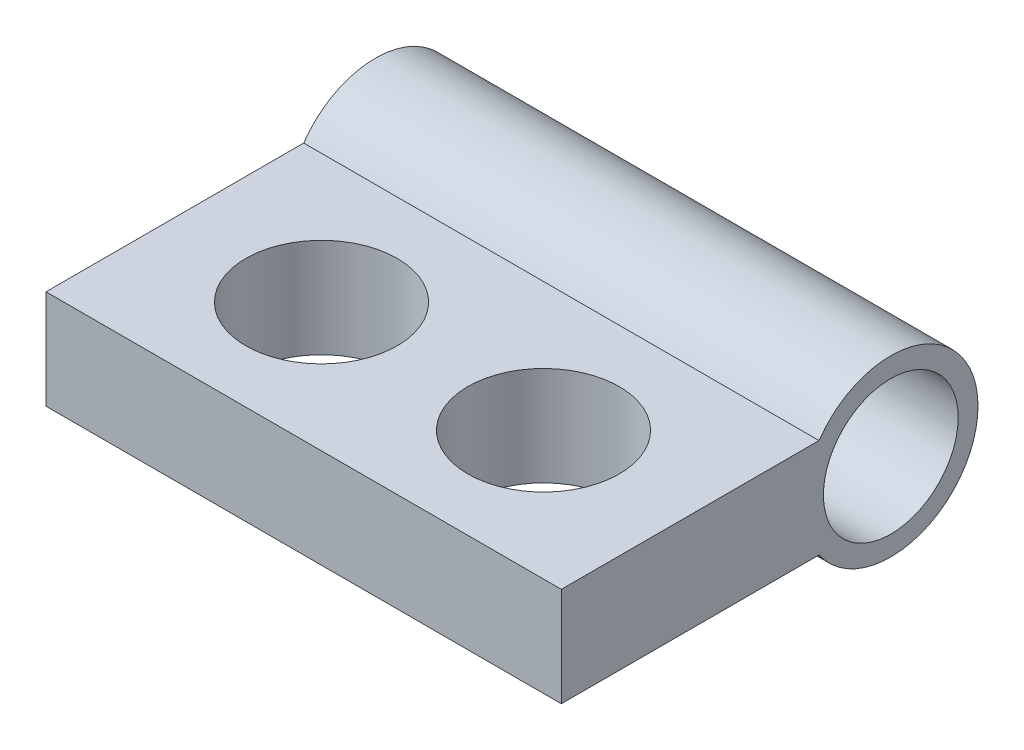
ISO-10303-21;
HEADER;
FILE_DESCRIPTION(('STEP AP214'),'2;1');
FILE_NAME('part.step','',(''),(''),'','','');
FILE_SCHEMA(('AUTOMOTIVE_DESIGN { 1 0 10303 214 1 1 1 1 }'));
ENDSEC;
DATA;
#1=APPLICATION_CONTEXT('core data for automotive mechanical design processes');
#2=APPLICATION_PROTOCOL_DEFINITION('international standard','automotive_design',2000,#1);
#3=PRODUCT_CONTEXT('',#1,'mechanical');
#4=PRODUCT('Part','Part','',(#3));
#5=PRODUCT_RELATED_PRODUCT_CATEGORY('part','',(#4));
#6=PRODUCT_DEFINITION_FORMATION('','',#4);
#7=PRODUCT_DEFINITION_CONTEXT('part definition',#1,'design');
#8=PRODUCT_DEFINITION('design','',#6,#7);
#9=PRODUCT_DEFINITION_SHAPE('','',#8);
#10=(LENGTH_UNIT() NAMED_UNIT(*) SI_UNIT(.MILLI.,.METRE.));
#11=(NAMED_UNIT(*) PLANE_ANGLE_UNIT() SI_UNIT($,.RADIAN.));
#12=(NAMED_UNIT(*) SI_UNIT($,.STERADIAN.) SOLID_ANGLE_UNIT());
#13=UNCERTAINTY_MEASURE_WITH_UNIT(LENGTH_MEASURE(1.E-05),#10,'distance_accuracy_value','');
#14=(GEOMETRIC_REPRESENTATION_CONTEXT(3) GLOBAL_UNCERTAINTY_ASSIGNED_CONTEXT((#13)) GLOBAL_UNIT_ASSIGNED_CONTEXT((#10,
#11,#12)) REPRESENTATION_CONTEXT('',''));
#15=CARTESIAN_POINT('',(0.,0.,0.));
#16=DIRECTION('',(0.,0.,1.));
#17=DIRECTION('',(1.,0.,0.));
#18=AXIS2_PLACEMENT_3D('',#15,#16,#17);
#19=CARTESIAN_POINT('',(0.,15.875,0.));
#20=DIRECTION('',(0.,-1.,0.));
#21=DIRECTION('',(0.,0.,-1.));
#22=AXIS2_PLACEMENT_3D('',#19,#20,#21);
#23=PLANE('',#22);
#24=DIRECTION('',(0.,0.,-1.));
#25=VECTOR('',#24,1.);
#26=CARTESIAN_POINT('',(41.275,15.875,20.6375));
#27=LINE('',#26,#25);
#28=CARTESIAN_POINT('',(41.275,15.875,20.6375));
#29=VERTEX_POINT('',#28);
#30=CARTESIAN_POINT('',(41.275,15.875,-20.6375));
#31=VERTEX_POINT('',#30);
#32=EDGE_CURVE('E73',#29,#31,#27,.T.);
#33=ORIENTED_EDGE('',*,*,#32,.T.);
#34=DIRECTION('',(-1.,0.,0.));
#35=VECTOR('',#34,1.);
#36=CARTESIAN_POINT('',(-41.275,15.875,-20.6375));
#37=LINE('',#36,#35);
#38=CARTESIAN_POINT('',(-41.275,15.875,-20.6375));
#39=VERTEX_POINT('',#38);
#40=EDGE_CURVE('E96',#31,#39,#37,.T.);
#41=ORIENTED_EDGE('',*,*,#40,.T.);
#42=DIRECTION('',(0.,0.,1.));
#43=VECTOR('',#42,1.);
#44=CARTESIAN_POINT('',(-41.275,15.875,20.6375));
#45=LINE('',#44,#43);
#46=CARTESIAN_POINT('',(-41.275,15.875,20.6375));
#47=VERTEX_POINT('',#46);
#48=EDGE_CURVE('E94',#39,#47,#45,.T.);
#49=ORIENTED_EDGE('',*,*,#48,.T.);
#50=DIRECTION('',(1.,0.,0.));
#51=VECTOR('',#50,1.);
#52=CARTESIAN_POINT('',(-41.275,15.875,20.6375));
#53=LINE('',#52,#51);
#54=EDGE_CURVE('E50',#47,#29,#53,.T.);
#55=ORIENTED_EDGE('',*,*,#54,.T.);
#56=EDGE_LOOP('',(#33,#41,#49,#55));
#57=FACE_BOUND('',#56,.T.);
#58=CARTESIAN_POINT('',(17.78,15.875,0.));
#59=DIRECTION('',(0.,1.,0.));
#60=DIRECTION('',(0.,0.,1.));
#61=AXIS2_PLACEMENT_3D('',#58,#59,#60);
#62=CIRCLE('',#61,12.1285);
#63=CARTESIAN_POINT('',(17.78,15.875,12.1285));
#64=VERTEX_POINT('',#63);
#65=EDGE_CURVE('E85',#64,#64,#62,.T.);
#66=ORIENTED_EDGE('',*,*,#65,.F.);
#67=EDGE_LOOP('',(#66));
#68=FACE_BOUND('',#67,.T.);
#69=CARTESIAN_POINT('',(-17.78,15.875,0.));
#70=DIRECTION('',(0.,1.,0.));
#71=DIRECTION('',(0.,0.,-1.));
#72=AXIS2_PLACEMENT_3D('',#69,#70,#71);
#73=CIRCLE('',#72,12.1285);
#74=CARTESIAN_POINT('',(-17.78,15.875,-12.1285));
#75=VERTEX_POINT('',#74);
#76=EDGE_CURVE('E101',#75,#75,#73,.T.);
#77=ORIENTED_EDGE('',*,*,#76,.F.);
#78=EDGE_LOOP('',(#77));
#79=FACE_BOUND('',#78,.T.);
#80=ADVANCED_FACE('F33',(#57,#68,#79),#23,.F.);
#81=CARTESIAN_POINT('',(0.,0.,0.));
#82=DIRECTION('',(0.,-1.,0.));
#83=DIRECTION('',(0.,0.,-1.));
#84=AXIS2_PLACEMENT_3D('',#81,#82,#83);
#85=PLANE('',#84);
#86=CARTESIAN_POINT('',(17.78,0.,0.));
#87=DIRECTION('',(0.,1.,0.));
#88=DIRECTION('',(0.,0.,1.));
#89=AXIS2_PLACEMENT_3D('',#86,#87,#88);
#90=CIRCLE('',#89,12.1285);
#91=CARTESIAN_POINT('',(17.78,0.,12.1285));
#92=VERTEX_POINT('',#91);
#93=EDGE_CURVE('E89',#92,#92,#90,.T.);
#94=ORIENTED_EDGE('',*,*,#93,.T.);
#95=EDGE_LOOP('',(#94));
#96=FACE_BOUND('',#95,.T.);
#97=DIRECTION('',(0.,0.,-1.));
#98=VECTOR('',#97,1.);
#99=CARTESIAN_POINT('',(41.275,0.,20.6375));
#100=LINE('',#99,#98);
#101=CARTESIAN_POINT('',(41.275,0.,20.6375));
#102=VERTEX_POINT('',#101);
#103=CARTESIAN_POINT('',(41.275,0.,-20.6375));
#104=VERTEX_POINT('',#103);
#105=EDGE_CURVE('E79',#102,#104,#100,.T.);
#106=ORIENTED_EDGE('',*,*,#105,.F.);
#107=DIRECTION('',(1.,0.,0.));
#108=VECTOR('',#107,1.);
#109=CARTESIAN_POINT('',(-41.275,0.,20.6375));
#110=LINE('',#109,#108);
#111=CARTESIAN_POINT('',(-41.275,0.,20.6375));
#112=VERTEX_POINT('',#111);
#113=EDGE_CURVE('E67',#112,#102,#110,.T.);
#114=ORIENTED_EDGE('',*,*,#113,.F.);
#115=DIRECTION('',(0.,0.,1.));
#116=VECTOR('',#115,1.);
#117=CARTESIAN_POINT('',(-41.275,0.,20.6375));
#118=LINE('',#117,#116);
#119=CARTESIAN_POINT('',(-41.275,0.,-20.6375));
#120=VERTEX_POINT('',#119);
#121=EDGE_CURVE('E63',#120,#112,#118,.T.);
#122=ORIENTED_EDGE('',*,*,#121,.F.);
#123=DIRECTION('',(-1.,0.,0.));
#124=VECTOR('',#123,1.);
#125=CARTESIAN_POINT('',(-41.275,0.,-20.6375));
#126=LINE('',#125,#124);
#127=EDGE_CURVE('E84',#104,#120,#126,.T.);
#128=ORIENTED_EDGE('',*,*,#127,.F.);
#129=EDGE_LOOP('',(#106,#114,#122,#128));
#130=FACE_BOUND('',#129,.T.);
#131=CARTESIAN_POINT('',(-17.78,0.,0.));
#132=DIRECTION('',(0.,1.,0.));
#133=DIRECTION('',(0.,0.,-1.));
#134=AXIS2_PLACEMENT_3D('',#131,#132,#133);
#135=CIRCLE('',#134,12.1285);
#136=CARTESIAN_POINT('',(-17.78,0.,-12.1285));
#137=VERTEX_POINT('',#136);
#138=EDGE_CURVE('E103',#137,#137,#135,.T.);
#139=ORIENTED_EDGE('',*,*,#138,.T.);
#140=EDGE_LOOP('',(#139));
#141=FACE_BOUND('',#140,.T.);
#142=ADVANCED_FACE('F81',(#96,#130,#141),#85,.T.);
#143=CARTESIAN_POINT('',(41.275,15.875,20.6375));
#144=DIRECTION('',(-1.,0.,0.));
#145=DIRECTION('',(0.,0.,1.));
#146=AXIS2_PLACEMENT_3D('',#143,#144,#145);
#147=PLANE('',#146);
#148=ORIENTED_EDGE('',*,*,#105,.T.);
#149=CARTESIAN_POINT('',(41.275,7.9375,-32.1334555387971));
#150=DIRECTION('',(1.,0.,0.));
#151=DIRECTION('',(0.,0.,-1.));
#152=AXIS2_PLACEMENT_3D('',#149,#150,#151);
#153=CIRCLE('',#152,13.97);
#154=EDGE_CURVE('E112',#104,#31,#153,.T.);
#155=ORIENTED_EDGE('',*,*,#154,.T.);
#156=ORIENTED_EDGE('',*,*,#32,.F.);
#157=DIRECTION('',(0.,-1.,0.));
#158=VECTOR('',#157,1.);
#159=CARTESIAN_POINT('',(41.275,15.875,20.6375));
#160=LINE('',#159,#158);
#161=EDGE_CURVE('E42',#29,#102,#160,.T.);
#162=ORIENTED_EDGE('',*,*,#161,.T.);
#163=EDGE_LOOP('',(#148,#155,#156,#162));
#164=FACE_BOUND('',#163,.T.);
#165=CARTESIAN_POINT('',(41.275,7.9375,-32.1334555387971));
#166=DIRECTION('',(1.,0.,0.));
#167=DIRECTION('',(0.,0.,-1.));
#168=AXIS2_PLACEMENT_3D('',#165,#166,#167);
#169=CIRCLE('',#168,10.795);
#170=CARTESIAN_POINT('',(41.275,7.9375,-42.9284555387971));
#171=VERTEX_POINT('',#170);
#172=EDGE_CURVE('E114',#171,#171,#169,.T.);
#173=ORIENTED_EDGE('',*,*,#172,.F.);
#174=EDGE_LOOP('',(#173));
#175=FACE_BOUND('',#174,.T.);
#176=ADVANCED_FACE('F35',(#164,#175),#147,.F.);
#177=CARTESIAN_POINT('',(-41.275,15.875,20.6375));
#178=DIRECTION('',(1.,0.,0.));
#179=DIRECTION('',(0.,0.,-1.));
#180=AXIS2_PLACEMENT_3D('',#177,#178,#179);
#181=PLANE('',#180);
#182=ORIENTED_EDGE('',*,*,#48,.F.);
#183=CARTESIAN_POINT('',(-41.275,7.9375,-32.1334555387971));
#184=DIRECTION('',(1.,0.,0.));
#185=DIRECTION('',(0.,0.,-1.));
#186=AXIS2_PLACEMENT_3D('',#183,#184,#185);
#187=CIRCLE('',#186,13.97);
#188=EDGE_CURVE('E106',#39,#120,#187,.F.);
#189=ORIENTED_EDGE('',*,*,#188,.T.);
#190=ORIENTED_EDGE('',*,*,#121,.T.);
#191=DIRECTION('',(0.,-1.,0.));
#192=VECTOR('',#191,1.);
#193=CARTESIAN_POINT('',(-41.275,15.875,20.6375));
#194=LINE('',#193,#192);
#195=EDGE_CURVE('E11',#47,#112,#194,.T.);
#196=ORIENTED_EDGE('',*,*,#195,.F.);
#197=EDGE_LOOP('',(#182,#189,#190,#196));
#198=FACE_BOUND('',#197,.T.);
#199=CARTESIAN_POINT('',(-41.275,7.9375,-32.1334555387971));
#200=DIRECTION('',(1.,0.,0.));
#201=DIRECTION('',(0.,0.,-1.));
#202=AXIS2_PLACEMENT_3D('',#199,#200,#201);
#203=CIRCLE('',#202,10.795);
#204=CARTESIAN_POINT('',(-41.275,7.9375,-42.9284555387971));
#205=VERTEX_POINT('',#204);
#206=EDGE_CURVE('E109',#205,#205,#203,.F.);
#207=ORIENTED_EDGE('',*,*,#206,.F.);
#208=EDGE_LOOP('',(#207));
#209=FACE_BOUND('',#208,.T.);
#210=ADVANCED_FACE('F119',(#198,#209),#181,.F.);
#211=CARTESIAN_POINT('',(-41.275,15.875,20.6375));
#212=DIRECTION('',(0.,0.,-1.));
#213=DIRECTION('',(-1.,0.,0.));
#214=AXIS2_PLACEMENT_3D('',#211,#212,#213);
#215=PLANE('',#214);
#216=ORIENTED_EDGE('',*,*,#113,.T.);
#217=ORIENTED_EDGE('',*,*,#161,.F.);
#218=ORIENTED_EDGE('',*,*,#54,.F.);
#219=ORIENTED_EDGE('',*,*,#195,.T.);
#220=EDGE_LOOP('',(#216,#217,#218,#219));
#221=FACE_BOUND('',#220,.T.);
#222=ADVANCED_FACE('F69',(#221),#215,.F.);
#223=CARTESIAN_POINT('',(17.78,15.875,0.));
#224=DIRECTION('',(0.,-1.,0.));
#225=DIRECTION('',(0.,0.,-1.));
#226=AXIS2_PLACEMENT_3D('',#223,#224,#225);
#227=CYLINDRICAL_SURFACE('',#226,12.1285);
#228=ORIENTED_EDGE('',*,*,#65,.T.);
#229=EDGE_LOOP('',(#228));
#230=FACE_BOUND('',#229,.T.);
#231=ORIENTED_EDGE('',*,*,#93,.F.);
#232=EDGE_LOOP('',(#231));
#233=FACE_BOUND('',#232,.T.);
#234=ADVANCED_FACE('F139',(#230,#233),#227,.F.);
#235=CARTESIAN_POINT('',(-17.78,15.875,0.));
#236=DIRECTION('',(0.,-1.,0.));
#237=DIRECTION('',(0.,0.,-1.));
#238=AXIS2_PLACEMENT_3D('',#235,#236,#237);
#239=CYLINDRICAL_SURFACE('',#238,12.1285);
#240=ORIENTED_EDGE('',*,*,#76,.T.);
#241=EDGE_LOOP('',(#240));
#242=FACE_BOUND('',#241,.T.);
#243=ORIENTED_EDGE('',*,*,#138,.F.);
#244=EDGE_LOOP('',(#243));
#245=FACE_BOUND('',#244,.T.);
#246=ADVANCED_FACE('F136',(#242,#245),#239,.F.);
#247=CARTESIAN_POINT('',(-80.7881269327043,7.9375,-32.1334555387971));
#248=DIRECTION('',(1.,0.,0.));
#249=DIRECTION('',(0.,0.,-1.));
#250=AXIS2_PLACEMENT_3D('',#247,#248,#249);
#251=CYLINDRICAL_SURFACE('',#250,13.97);
#252=ORIENTED_EDGE('',*,*,#127,.T.);
#253=ORIENTED_EDGE('',*,*,#188,.F.);
#254=ORIENTED_EDGE('',*,*,#40,.F.);
#255=ORIENTED_EDGE('',*,*,#154,.F.);
#256=EDGE_LOOP('',(#252,#253,#254,#255));
#257=FACE_BOUND('',#256,.T.);
#258=ADVANCED_FACE('F125',(#257),#251,.T.);
#259=CARTESIAN_POINT('',(-80.7881269327043,7.9375,-32.1334555387971));
#260=DIRECTION('',(1.,0.,0.));
#261=DIRECTION('',(0.,0.,-1.));
#262=AXIS2_PLACEMENT_3D('',#259,#260,#261);
#263=CYLINDRICAL_SURFACE('',#262,10.795);
#264=ORIENTED_EDGE('',*,*,#206,.T.);
#265=EDGE_LOOP('',(#264));
#266=FACE_BOUND('',#265,.T.);
#267=ORIENTED_EDGE('',*,*,#172,.T.);
#268=EDGE_LOOP('',(#267));
#269=FACE_BOUND('',#268,.T.);
#270=ADVANCED_FACE('F177',(#266,#269),#263,.F.);
#271=CLOSED_SHELL('',(#80,#142,#176,#210,#222,#234,#246,#258,#270));
#272=MANIFOLD_SOLID_BREP('B2',#271);
#273=ADVANCED_BREP_SHAPE_REPRESENTATION('',(#18,#272),#14);
#274=SHAPE_DEFINITION_REPRESENTATION(#9,#273);
ENDSEC;
END-ISO-10303-21;
